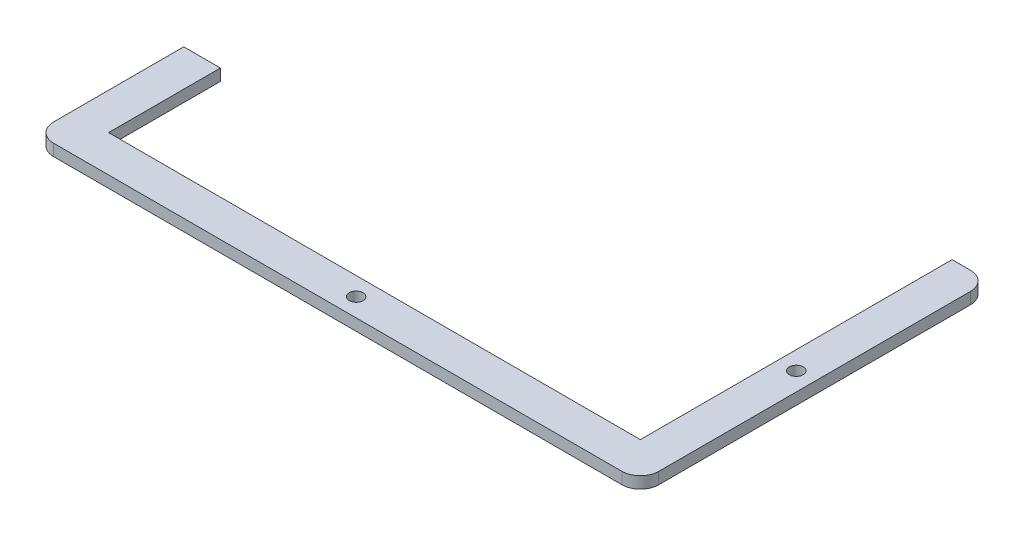
ISO-10303-21;
HEADER;
FILE_DESCRIPTION(('STEP AP214'),'2;1');
FILE_NAME('part.step','',(''),(''),'','','');
FILE_SCHEMA(('AUTOMOTIVE_DESIGN { 1 0 10303 214 1 1 1 1 }'));
ENDSEC;
DATA;
#1=APPLICATION_CONTEXT('core data for automotive mechanical design processes');
#2=APPLICATION_PROTOCOL_DEFINITION('international standard','automotive_design',2000,#1);
#3=PRODUCT_CONTEXT('',#1,'mechanical');
#4=PRODUCT('Part','Part','',(#3));
#5=PRODUCT_RELATED_PRODUCT_CATEGORY('part','',(#4));
#6=PRODUCT_DEFINITION_FORMATION('','',#4);
#7=PRODUCT_DEFINITION_CONTEXT('part definition',#1,'design');
#8=PRODUCT_DEFINITION('design','',#6,#7);
#9=PRODUCT_DEFINITION_SHAPE('','',#8);
#10=(LENGTH_UNIT() NAMED_UNIT(*) SI_UNIT(.MILLI.,.METRE.));
#11=(NAMED_UNIT(*) PLANE_ANGLE_UNIT() SI_UNIT($,.RADIAN.));
#12=(NAMED_UNIT(*) SI_UNIT($,.STERADIAN.) SOLID_ANGLE_UNIT());
#13=UNCERTAINTY_MEASURE_WITH_UNIT(LENGTH_MEASURE(1.E-05),#10,'distance_accuracy_value','');
#14=(GEOMETRIC_REPRESENTATION_CONTEXT(3) GLOBAL_UNCERTAINTY_ASSIGNED_CONTEXT((#13)) GLOBAL_UNIT_ASSIGNED_CONTEXT((#10,
#11,#12)) REPRESENTATION_CONTEXT('',''));
#15=CARTESIAN_POINT('',(0.,0.,0.));
#16=DIRECTION('',(0.,0.,1.));
#17=DIRECTION('',(1.,0.,0.));
#18=AXIS2_PLACEMENT_3D('',#15,#16,#17);
#19=CARTESIAN_POINT('',(0.,3.175,0.));
#20=DIRECTION('',(-1.,0.,0.));
#21=DIRECTION('',(0.,0.,1.));
#22=AXIS2_PLACEMENT_3D('',#19,#20,#21);
#23=PLANE('',#22);
#24=DIRECTION('',(0.,0.,-1.));
#25=VECTOR('',#24,1.);
#26=CARTESIAN_POINT('',(0.,0.,0.));
#27=LINE('',#26,#25);
#28=CARTESIAN_POINT('',(0.,0.,-5.00000000000004));
#29=VERTEX_POINT('',#28);
#30=CARTESIAN_POINT('',(0.,0.,-90.));
#31=VERTEX_POINT('',#30);
#32=EDGE_CURVE('E238',#29,#31,#27,.T.);
#33=ORIENTED_EDGE('',*,*,#32,.T.);
#34=DIRECTION('',(0.,-1.,0.));
#35=VECTOR('',#34,1.);
#36=CARTESIAN_POINT('',(0.,3.175,-90.));
#37=LINE('',#36,#35);
#38=CARTESIAN_POINT('',(0.,3.175,-90.));
#39=VERTEX_POINT('',#38);
#40=EDGE_CURVE('E12',#39,#31,#37,.T.);
#41=ORIENTED_EDGE('',*,*,#40,.F.);
#42=DIRECTION('',(0.,0.,-1.));
#43=VECTOR('',#42,1.);
#44=CARTESIAN_POINT('',(0.,3.175,0.));
#45=LINE('',#44,#43);
#46=CARTESIAN_POINT('',(0.,3.175,-5.00000000000004));
#47=VERTEX_POINT('',#46);
#48=EDGE_CURVE('E190',#47,#39,#45,.T.);
#49=ORIENTED_EDGE('',*,*,#48,.F.);
#50=DIRECTION('',(0.,-1.,0.));
#51=VECTOR('',#50,1.);
#52=CARTESIAN_POINT('',(0.,3.175,-5.00000000000004));
#53=LINE('',#52,#51);
#54=EDGE_CURVE('E149',#47,#29,#53,.T.);
#55=ORIENTED_EDGE('',*,*,#54,.T.);
#56=EDGE_LOOP('',(#33,#41,#49,#55));
#57=FACE_BOUND('',#56,.T.);
#58=ADVANCED_FACE('F36',(#57),#23,.F.);
#59=CARTESIAN_POINT('',(-5.,3.175,-90.));
#60=DIRECTION('',(0.,-1.,0.));
#61=DIRECTION('',(0.,0.,-1.));
#62=AXIS2_PLACEMENT_3D('',#59,#60,#61);
#63=CYLINDRICAL_SURFACE('',#62,5.);
#64=CARTESIAN_POINT('',(-5.,0.,-90.));
#65=DIRECTION('',(0.,1.,0.));
#66=DIRECTION('',(0.,0.,1.));
#67=AXIS2_PLACEMENT_3D('',#64,#65,#66);
#68=CIRCLE('',#67,5.);
#69=CARTESIAN_POINT('',(-5.,0.,-95.));
#70=VERTEX_POINT('',#69);
#71=EDGE_CURVE('E232',#31,#70,#68,.T.);
#72=ORIENTED_EDGE('',*,*,#71,.T.);
#73=DIRECTION('',(0.,-1.,0.));
#74=VECTOR('',#73,1.);
#75=CARTESIAN_POINT('',(-5.,3.175,-95.));
#76=LINE('',#75,#74);
#77=CARTESIAN_POINT('',(-5.,3.175,-95.));
#78=VERTEX_POINT('',#77);
#79=EDGE_CURVE('E45',#78,#70,#76,.T.);
#80=ORIENTED_EDGE('',*,*,#79,.F.);
#81=CARTESIAN_POINT('',(-5.,3.175,-90.));
#82=DIRECTION('',(0.,1.,0.));
#83=DIRECTION('',(0.,0.,1.));
#84=AXIS2_PLACEMENT_3D('',#81,#82,#83);
#85=CIRCLE('',#84,5.);
#86=EDGE_CURVE('E101',#39,#78,#85,.T.);
#87=ORIENTED_EDGE('',*,*,#86,.F.);
#88=ORIENTED_EDGE('',*,*,#40,.T.);
#89=EDGE_LOOP('',(#72,#80,#87,#88));
#90=FACE_BOUND('',#89,.T.);
#91=ADVANCED_FACE('F233',(#90),#63,.T.);
#92=CARTESIAN_POINT('',(0.,3.175,-95.));
#93=DIRECTION('',(0.,0.,-1.));
#94=DIRECTION('',(-1.,0.,0.));
#95=AXIS2_PLACEMENT_3D('',#92,#93,#94);
#96=PLANE('',#95);
#97=DIRECTION('',(1.,0.,0.));
#98=VECTOR('',#97,1.);
#99=CARTESIAN_POINT('',(0.,0.,-95.));
#100=LINE('',#99,#98);
#101=CARTESIAN_POINT('',(-10.,0.,-95.));
#102=VERTEX_POINT('',#101);
#103=EDGE_CURVE('E229',#102,#70,#100,.T.);
#104=ORIENTED_EDGE('',*,*,#103,.F.);
#105=DIRECTION('',(0.,-1.,0.));
#106=VECTOR('',#105,1.);
#107=CARTESIAN_POINT('',(-10.,3.175,-95.));
#108=LINE('',#107,#106);
#109=CARTESIAN_POINT('',(-10.,3.175,-95.));
#110=VERTEX_POINT('',#109);
#111=EDGE_CURVE('E223',#110,#102,#108,.T.);
#112=ORIENTED_EDGE('',*,*,#111,.F.);
#113=DIRECTION('',(1.,0.,0.));
#114=VECTOR('',#113,1.);
#115=CARTESIAN_POINT('',(0.,3.175,-95.));
#116=LINE('',#115,#114);
#117=EDGE_CURVE('E182',#110,#78,#116,.T.);
#118=ORIENTED_EDGE('',*,*,#117,.T.);
#119=ORIENTED_EDGE('',*,*,#79,.T.);
#120=EDGE_LOOP('',(#104,#112,#118,#119));
#121=FACE_BOUND('',#120,.T.);
#122=ADVANCED_FACE('F227',(#121),#96,.T.);
#123=CARTESIAN_POINT('',(-10.0000000000001,3.175,0.));
#124=DIRECTION('',(-1.,0.,0.));
#125=DIRECTION('',(0.,0.,1.));
#126=AXIS2_PLACEMENT_3D('',#123,#124,#125);
#127=PLANE('',#126);
#128=DIRECTION('',(0.,0.,-1.));
#129=VECTOR('',#128,1.);
#130=CARTESIAN_POINT('',(-10.0000000000001,0.,0.));
#131=LINE('',#130,#129);
#132=CARTESIAN_POINT('',(-10.,0.,-9.99999999999998));
#133=VERTEX_POINT('',#132);
#134=EDGE_CURVE('E243',#133,#102,#131,.T.);
#135=ORIENTED_EDGE('',*,*,#134,.F.);
#136=DIRECTION('',(0.,-1.,0.));
#137=VECTOR('',#136,1.);
#138=CARTESIAN_POINT('',(-10.,3.175,-9.99999999999998));
#139=LINE('',#138,#137);
#140=CARTESIAN_POINT('',(-10.,3.175,-9.99999999999998));
#141=VERTEX_POINT('',#140);
#142=EDGE_CURVE('E221',#141,#133,#139,.T.);
#143=ORIENTED_EDGE('',*,*,#142,.F.);
#144=DIRECTION('',(0.,0.,-1.));
#145=VECTOR('',#144,1.);
#146=CARTESIAN_POINT('',(-10.0000000000001,3.175,0.));
#147=LINE('',#146,#145);
#148=EDGE_CURVE('E178',#141,#110,#147,.T.);
#149=ORIENTED_EDGE('',*,*,#148,.T.);
#150=ORIENTED_EDGE('',*,*,#111,.T.);
#151=EDGE_LOOP('',(#135,#143,#149,#150));
#152=FACE_BOUND('',#151,.T.);
#153=ADVANCED_FACE('F288',(#152),#127,.T.);
#154=CARTESIAN_POINT('',(0.,3.175,-9.99999999999998));
#155=DIRECTION('',(0.,0.,-1.));
#156=DIRECTION('',(-1.,0.,0.));
#157=AXIS2_PLACEMENT_3D('',#154,#155,#156);
#158=PLANE('',#157);
#159=DIRECTION('',(1.,0.,0.));
#160=VECTOR('',#159,1.);
#161=CARTESIAN_POINT('',(0.,0.,-9.99999999999998));
#162=LINE('',#161,#160);
#163=CARTESIAN_POINT('',(-155.,0.,-9.99999999999998));
#164=VERTEX_POINT('',#163);
#165=EDGE_CURVE('E245',#164,#133,#162,.T.);
#166=ORIENTED_EDGE('',*,*,#165,.F.);
#167=DIRECTION('',(0.,-1.,0.));
#168=VECTOR('',#167,1.);
#169=CARTESIAN_POINT('',(-155.,3.175,-9.99999999999998));
#170=LINE('',#169,#168);
#171=CARTESIAN_POINT('',(-155.,3.175,-9.99999999999998));
#172=VERTEX_POINT('',#171);
#173=EDGE_CURVE('E219',#172,#164,#170,.T.);
#174=ORIENTED_EDGE('',*,*,#173,.F.);
#175=DIRECTION('',(1.,0.,0.));
#176=VECTOR('',#175,1.);
#177=CARTESIAN_POINT('',(0.,3.175,-9.99999999999998));
#178=LINE('',#177,#176);
#179=EDGE_CURVE('E170',#172,#141,#178,.T.);
#180=ORIENTED_EDGE('',*,*,#179,.T.);
#181=ORIENTED_EDGE('',*,*,#142,.T.);
#182=EDGE_LOOP('',(#166,#174,#180,#181));
#183=FACE_BOUND('',#182,.T.);
#184=ADVANCED_FACE('F291',(#183),#158,.T.);
#185=CARTESIAN_POINT('',(-155.,3.175,0.));
#186=DIRECTION('',(1.,0.,0.));
#187=DIRECTION('',(0.,0.,-1.));
#188=AXIS2_PLACEMENT_3D('',#185,#186,#187);
#189=PLANE('',#188);
#190=DIRECTION('',(0.,0.,1.));
#191=VECTOR('',#190,1.);
#192=CARTESIAN_POINT('',(-155.,0.,0.));
#193=LINE('',#192,#191);
#194=CARTESIAN_POINT('',(-155.,0.,-40.5));
#195=VERTEX_POINT('',#194);
#196=EDGE_CURVE('E250',#195,#164,#193,.T.);
#197=ORIENTED_EDGE('',*,*,#196,.F.);
#198=DIRECTION('',(0.,-1.,0.));
#199=VECTOR('',#198,1.);
#200=CARTESIAN_POINT('',(-155.,3.175,-40.5));
#201=LINE('',#200,#199);
#202=CARTESIAN_POINT('',(-155.,3.175,-40.5));
#203=VERTEX_POINT('',#202);
#204=EDGE_CURVE('E217',#203,#195,#201,.T.);
#205=ORIENTED_EDGE('',*,*,#204,.F.);
#206=DIRECTION('',(0.,0.,1.));
#207=VECTOR('',#206,1.);
#208=CARTESIAN_POINT('',(-155.,3.175,0.));
#209=LINE('',#208,#207);
#210=EDGE_CURVE('E165',#203,#172,#209,.T.);
#211=ORIENTED_EDGE('',*,*,#210,.T.);
#212=ORIENTED_EDGE('',*,*,#173,.T.);
#213=EDGE_LOOP('',(#197,#205,#211,#212));
#214=FACE_BOUND('',#213,.T.);
#215=ADVANCED_FACE('F295',(#214),#189,.T.);
#216=CARTESIAN_POINT('',(0.,3.175,-40.5));
#217=DIRECTION('',(0.,0.,-1.));
#218=DIRECTION('',(-1.,0.,0.));
#219=AXIS2_PLACEMENT_3D('',#216,#217,#218);
#220=PLANE('',#219);
#221=DIRECTION('',(1.,0.,0.));
#222=VECTOR('',#221,1.);
#223=CARTESIAN_POINT('',(0.,0.,-40.5));
#224=LINE('',#223,#222);
#225=CARTESIAN_POINT('',(-165.,0.,-40.5));
#226=VERTEX_POINT('',#225);
#227=EDGE_CURVE('E253',#226,#195,#224,.T.);
#228=ORIENTED_EDGE('',*,*,#227,.F.);
#229=DIRECTION('',(0.,-1.,0.));
#230=VECTOR('',#229,1.);
#231=CARTESIAN_POINT('',(-165.,3.175,-40.5));
#232=LINE('',#231,#230);
#233=CARTESIAN_POINT('',(-165.,3.175,-40.5));
#234=VERTEX_POINT('',#233);
#235=EDGE_CURVE('E215',#234,#226,#232,.T.);
#236=ORIENTED_EDGE('',*,*,#235,.F.);
#237=DIRECTION('',(1.,0.,0.));
#238=VECTOR('',#237,1.);
#239=CARTESIAN_POINT('',(0.,3.175,-40.5));
#240=LINE('',#239,#238);
#241=EDGE_CURVE('E160',#234,#203,#240,.T.);
#242=ORIENTED_EDGE('',*,*,#241,.T.);
#243=ORIENTED_EDGE('',*,*,#204,.T.);
#244=EDGE_LOOP('',(#228,#236,#242,#243));
#245=FACE_BOUND('',#244,.T.);
#246=ADVANCED_FACE('F299',(#245),#220,.T.);
#247=CARTESIAN_POINT('',(-165.,3.175,0.));
#248=DIRECTION('',(1.,0.,0.));
#249=DIRECTION('',(0.,0.,-1.));
#250=AXIS2_PLACEMENT_3D('',#247,#248,#249);
#251=PLANE('',#250);
#252=DIRECTION('',(0.,0.,1.));
#253=VECTOR('',#252,1.);
#254=CARTESIAN_POINT('',(-165.,0.,0.));
#255=LINE('',#254,#253);
#256=CARTESIAN_POINT('',(-165.,0.,-5.00000000000002));
#257=VERTEX_POINT('',#256);
#258=EDGE_CURVE('E256',#226,#257,#255,.T.);
#259=ORIENTED_EDGE('',*,*,#258,.T.);
#260=DIRECTION('',(0.,-1.,0.));
#261=VECTOR('',#260,1.);
#262=CARTESIAN_POINT('',(-165.,3.175,-5.00000000000002));
#263=LINE('',#262,#261);
#264=CARTESIAN_POINT('',(-165.,3.175,-5.00000000000002));
#265=VERTEX_POINT('',#264);
#266=EDGE_CURVE('E135',#265,#257,#263,.T.);
#267=ORIENTED_EDGE('',*,*,#266,.F.);
#268=DIRECTION('',(0.,0.,1.));
#269=VECTOR('',#268,1.);
#270=CARTESIAN_POINT('',(-165.,3.175,0.));
#271=LINE('',#270,#269);
#272=EDGE_CURVE('E141',#234,#265,#271,.T.);
#273=ORIENTED_EDGE('',*,*,#272,.F.);
#274=ORIENTED_EDGE('',*,*,#235,.T.);
#275=EDGE_LOOP('',(#259,#267,#273,#274));
#276=FACE_BOUND('',#275,.T.);
#277=ADVANCED_FACE('F303',(#276),#251,.F.);
#278=CARTESIAN_POINT('',(-160.,3.175,-4.99999999999998));
#279=DIRECTION('',(0.,-1.,0.));
#280=DIRECTION('',(0.,0.,-1.));
#281=AXIS2_PLACEMENT_3D('',#278,#279,#280);
#282=CYLINDRICAL_SURFACE('',#281,5.);
#283=CARTESIAN_POINT('',(-160.,0.,-4.99999999999998));
#284=DIRECTION('',(0.,1.,0.));
#285=DIRECTION('',(0.,0.,1.));
#286=AXIS2_PLACEMENT_3D('',#283,#284,#285);
#287=CIRCLE('',#286,5.);
#288=CARTESIAN_POINT('',(-160.,0.,0.));
#289=VERTEX_POINT('',#288);
#290=EDGE_CURVE('E130',#289,#257,#287,.F.);
#291=ORIENTED_EDGE('',*,*,#290,.F.);
#292=DIRECTION('',(0.,-1.,0.));
#293=VECTOR('',#292,1.);
#294=CARTESIAN_POINT('',(-160.,3.175,0.));
#295=LINE('',#294,#293);
#296=CARTESIAN_POINT('',(-160.,3.175,0.));
#297=VERTEX_POINT('',#296);
#298=EDGE_CURVE('E125',#297,#289,#295,.T.);
#299=ORIENTED_EDGE('',*,*,#298,.F.);
#300=CARTESIAN_POINT('',(-160.,3.175,-4.99999999999998));
#301=DIRECTION('',(0.,1.,0.));
#302=DIRECTION('',(0.,0.,1.));
#303=AXIS2_PLACEMENT_3D('',#300,#301,#302);
#304=CIRCLE('',#303,5.);
#305=EDGE_CURVE('E128',#297,#265,#304,.F.);
#306=ORIENTED_EDGE('',*,*,#305,.T.);
#307=ORIENTED_EDGE('',*,*,#266,.T.);
#308=EDGE_LOOP('',(#291,#299,#306,#307));
#309=FACE_BOUND('',#308,.T.);
#310=ADVANCED_FACE('F127',(#309),#282,.T.);
#311=CARTESIAN_POINT('',(0.,3.175,0.));
#312=DIRECTION('',(0.,0.,1.));
#313=DIRECTION('',(1.,0.,0.));
#314=AXIS2_PLACEMENT_3D('',#311,#312,#313);
#315=PLANE('',#314);
#316=DIRECTION('',(-1.,0.,0.));
#317=VECTOR('',#316,1.);
#318=CARTESIAN_POINT('',(0.,0.,0.));
#319=LINE('',#318,#317);
#320=CARTESIAN_POINT('',(-5.00000000000004,0.,0.));
#321=VERTEX_POINT('',#320);
#322=EDGE_CURVE('E207',#321,#289,#319,.T.);
#323=ORIENTED_EDGE('',*,*,#322,.F.);
#324=DIRECTION('',(0.,-1.,0.));
#325=VECTOR('',#324,1.);
#326=CARTESIAN_POINT('',(-5.00000000000004,3.175,0.));
#327=LINE('',#326,#325);
#328=CARTESIAN_POINT('',(-5.00000000000004,3.175,0.));
#329=VERTEX_POINT('',#328);
#330=EDGE_CURVE('E90',#329,#321,#327,.T.);
#331=ORIENTED_EDGE('',*,*,#330,.F.);
#332=DIRECTION('',(-1.,0.,0.));
#333=VECTOR('',#332,1.);
#334=CARTESIAN_POINT('',(0.,3.175,0.));
#335=LINE('',#334,#333);
#336=EDGE_CURVE('E138',#329,#297,#335,.T.);
#337=ORIENTED_EDGE('',*,*,#336,.T.);
#338=ORIENTED_EDGE('',*,*,#298,.T.);
#339=EDGE_LOOP('',(#323,#331,#337,#338));
#340=FACE_BOUND('',#339,.T.);
#341=ADVANCED_FACE('F145',(#340),#315,.T.);
#342=CARTESIAN_POINT('',(-5.,3.175,-47.5));
#343=DIRECTION('',(0.,-1.,0.));
#344=DIRECTION('',(0.,0.,-1.));
#345=AXIS2_PLACEMENT_3D('',#342,#343,#344);
#346=CYLINDRICAL_SURFACE('',#345,1.875);
#347=CARTESIAN_POINT('',(-5.,3.175,-47.5));
#348=DIRECTION('',(0.,1.,0.));
#349=DIRECTION('',(0.,0.,1.));
#350=AXIS2_PLACEMENT_3D('',#347,#348,#349);
#351=CIRCLE('',#350,1.875);
#352=CARTESIAN_POINT('',(-5.,3.175,-45.625));
#353=VERTEX_POINT('',#352);
#354=EDGE_CURVE('E197',#353,#353,#351,.T.);
#355=ORIENTED_EDGE('',*,*,#354,.T.);
#356=EDGE_LOOP('',(#355));
#357=FACE_BOUND('',#356,.T.);
#358=CARTESIAN_POINT('',(-5.,0.,-47.5));
#359=DIRECTION('',(0.,1.,0.));
#360=DIRECTION('',(0.,0.,1.));
#361=AXIS2_PLACEMENT_3D('',#358,#359,#360);
#362=CIRCLE('',#361,1.875);
#363=CARTESIAN_POINT('',(-5.,0.,-45.625));
#364=VERTEX_POINT('',#363);
#365=EDGE_CURVE('E261',#364,#364,#362,.T.);
#366=ORIENTED_EDGE('',*,*,#365,.F.);
#367=EDGE_LOOP('',(#366));
#368=FACE_BOUND('',#367,.T.);
#369=ADVANCED_FACE('F272',(#357,#368),#346,.F.);
#370=CARTESIAN_POINT('',(-82.5,3.175,-5.));
#371=DIRECTION('',(0.,-1.,0.));
#372=DIRECTION('',(0.,0.,-1.));
#373=AXIS2_PLACEMENT_3D('',#370,#371,#372);
#374=CYLINDRICAL_SURFACE('',#373,1.875);
#375=CARTESIAN_POINT('',(-82.5,3.175,-5.));
#376=DIRECTION('',(0.,1.,0.));
#377=DIRECTION('',(0.,0.,1.));
#378=AXIS2_PLACEMENT_3D('',#375,#376,#377);
#379=CIRCLE('',#378,1.875);
#380=CARTESIAN_POINT('',(-82.5,3.175,-3.125));
#381=VERTEX_POINT('',#380);
#382=EDGE_CURVE('E201',#381,#381,#379,.T.);
#383=ORIENTED_EDGE('',*,*,#382,.T.);
#384=EDGE_LOOP('',(#383));
#385=FACE_BOUND('',#384,.T.);
#386=CARTESIAN_POINT('',(-82.5,0.,-5.));
#387=DIRECTION('',(0.,1.,0.));
#388=DIRECTION('',(0.,0.,1.));
#389=AXIS2_PLACEMENT_3D('',#386,#387,#388);
#390=CIRCLE('',#389,1.875);
#391=CARTESIAN_POINT('',(-82.5,0.,-3.125));
#392=VERTEX_POINT('',#391);
#393=EDGE_CURVE('E263',#392,#392,#390,.T.);
#394=ORIENTED_EDGE('',*,*,#393,.F.);
#395=EDGE_LOOP('',(#394));
#396=FACE_BOUND('',#395,.T.);
#397=ADVANCED_FACE('F38',(#385,#396),#374,.F.);
#398=CARTESIAN_POINT('',(-5.,3.175,-5.));
#399=DIRECTION('',(0.,-1.,0.));
#400=DIRECTION('',(0.,0.,-1.));
#401=AXIS2_PLACEMENT_3D('',#398,#399,#400);
#402=CYLINDRICAL_SURFACE('',#401,5.);
#403=CARTESIAN_POINT('',(-5.,0.,-5.));
#404=DIRECTION('',(0.,1.,0.));
#405=DIRECTION('',(0.,0.,1.));
#406=AXIS2_PLACEMENT_3D('',#403,#404,#405);
#407=CIRCLE('',#406,5.);
#408=EDGE_CURVE('E93',#321,#29,#407,.T.);
#409=ORIENTED_EDGE('',*,*,#408,.T.);
#410=ORIENTED_EDGE('',*,*,#54,.F.);
#411=CARTESIAN_POINT('',(-5.,3.175,-5.));
#412=DIRECTION('',(0.,1.,0.));
#413=DIRECTION('',(0.,0.,1.));
#414=AXIS2_PLACEMENT_3D('',#411,#412,#413);
#415=CIRCLE('',#414,5.);
#416=EDGE_CURVE('E53',#329,#47,#415,.T.);
#417=ORIENTED_EDGE('',*,*,#416,.F.);
#418=ORIENTED_EDGE('',*,*,#330,.T.);
#419=EDGE_LOOP('',(#409,#410,#417,#418));
#420=FACE_BOUND('',#419,.T.);
#421=ADVANCED_FACE('F271',(#420),#402,.T.);
#422=CARTESIAN_POINT('',(0.,3.175,0.));
#423=DIRECTION('',(0.,1.,0.));
#424=DIRECTION('',(0.,0.,1.));
#425=AXIS2_PLACEMENT_3D('',#422,#423,#424);
#426=PLANE('',#425);
#427=ORIENTED_EDGE('',*,*,#382,.F.);
#428=EDGE_LOOP('',(#427));
#429=FACE_BOUND('',#428,.T.);
#430=ORIENTED_EDGE('',*,*,#354,.F.);
#431=EDGE_LOOP('',(#430));
#432=FACE_BOUND('',#431,.T.);
#433=ORIENTED_EDGE('',*,*,#48,.T.);
#434=ORIENTED_EDGE('',*,*,#86,.T.);
#435=ORIENTED_EDGE('',*,*,#117,.F.);
#436=ORIENTED_EDGE('',*,*,#148,.F.);
#437=ORIENTED_EDGE('',*,*,#179,.F.);
#438=ORIENTED_EDGE('',*,*,#210,.F.);
#439=ORIENTED_EDGE('',*,*,#241,.F.);
#440=ORIENTED_EDGE('',*,*,#272,.T.);
#441=ORIENTED_EDGE('',*,*,#305,.F.);
#442=ORIENTED_EDGE('',*,*,#336,.F.);
#443=ORIENTED_EDGE('',*,*,#416,.T.);
#444=EDGE_LOOP('',(#433,#434,#435,#436,#437,#438,#439,#440,#441,#442,#443));
#445=FACE_BOUND('',#444,.T.);
#446=ADVANCED_FACE('F137',(#429,#432,#445),#426,.T.);
#447=CARTESIAN_POINT('',(0.,0.,0.));
#448=DIRECTION('',(0.,1.,0.));
#449=DIRECTION('',(0.,0.,1.));
#450=AXIS2_PLACEMENT_3D('',#447,#448,#449);
#451=PLANE('',#450);
#452=ORIENTED_EDGE('',*,*,#393,.T.);
#453=EDGE_LOOP('',(#452));
#454=FACE_BOUND('',#453,.T.);
#455=ORIENTED_EDGE('',*,*,#365,.T.);
#456=EDGE_LOOP('',(#455));
#457=FACE_BOUND('',#456,.T.);
#458=ORIENTED_EDGE('',*,*,#32,.F.);
#459=ORIENTED_EDGE('',*,*,#408,.F.);
#460=ORIENTED_EDGE('',*,*,#322,.T.);
#461=ORIENTED_EDGE('',*,*,#290,.T.);
#462=ORIENTED_EDGE('',*,*,#258,.F.);
#463=ORIENTED_EDGE('',*,*,#227,.T.);
#464=ORIENTED_EDGE('',*,*,#196,.T.);
#465=ORIENTED_EDGE('',*,*,#165,.T.);
#466=ORIENTED_EDGE('',*,*,#134,.T.);
#467=ORIENTED_EDGE('',*,*,#103,.T.);
#468=ORIENTED_EDGE('',*,*,#71,.F.);
#469=EDGE_LOOP('',(#458,#459,#460,#461,#462,#463,#464,#465,#466,#467,#468));
#470=FACE_BOUND('',#469,.T.);
#471=ADVANCED_FACE('F240',(#454,#457,#470),#451,.F.);
#472=CLOSED_SHELL('',(#58,#91,#122,#153,#184,#215,#246,#277,#310,#341,#369,#397,#421,#446,#471));
#473=MANIFOLD_SOLID_BREP('B2',#472);
#474=ADVANCED_BREP_SHAPE_REPRESENTATION('',(#18,#473),#14);
#475=SHAPE_DEFINITION_REPRESENTATION(#9,#474);
ENDSEC;
END-ISO-10303-21;
